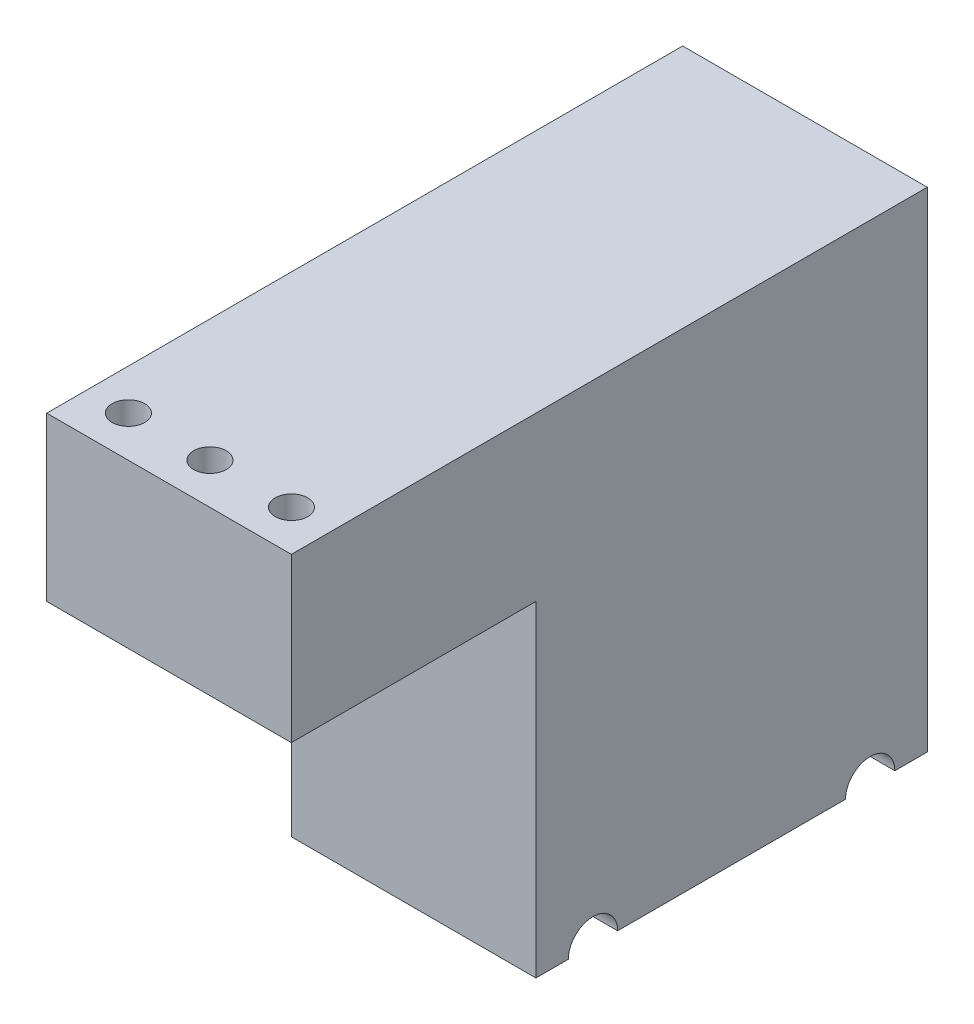
ISO-10303-21;
HEADER;
FILE_DESCRIPTION(('STEP AP214'),'2;1');
FILE_NAME('part.step','',(''),(''),'','','');
FILE_SCHEMA(('AUTOMOTIVE_DESIGN { 1 0 10303 214 1 1 1 1 }'));
ENDSEC;
DATA;
#1=APPLICATION_CONTEXT('core data for automotive mechanical design processes');
#2=APPLICATION_PROTOCOL_DEFINITION('international standard','automotive_design',2000,#1);
#3=PRODUCT_CONTEXT('',#1,'mechanical');
#4=PRODUCT('Part','Part','',(#3));
#5=PRODUCT_RELATED_PRODUCT_CATEGORY('part','',(#4));
#6=PRODUCT_DEFINITION_FORMATION('','',#4);
#7=PRODUCT_DEFINITION_CONTEXT('part definition',#1,'design');
#8=PRODUCT_DEFINITION('design','',#6,#7);
#9=PRODUCT_DEFINITION_SHAPE('','',#8);
#10=(LENGTH_UNIT() NAMED_UNIT(*) SI_UNIT(.MILLI.,.METRE.));
#11=(NAMED_UNIT(*) PLANE_ANGLE_UNIT() SI_UNIT($,.RADIAN.));
#12=(NAMED_UNIT(*) SI_UNIT($,.STERADIAN.) SOLID_ANGLE_UNIT());
#13=UNCERTAINTY_MEASURE_WITH_UNIT(LENGTH_MEASURE(1.E-05),#10,'distance_accuracy_value','');
#14=(GEOMETRIC_REPRESENTATION_CONTEXT(3) GLOBAL_UNCERTAINTY_ASSIGNED_CONTEXT((#13)) GLOBAL_UNIT_ASSIGNED_CONTEXT((#10,
#11,#12)) REPRESENTATION_CONTEXT('',''));
#15=CARTESIAN_POINT('',(0.,0.,0.));
#16=DIRECTION('',(0.,0.,1.));
#17=DIRECTION('',(1.,0.,0.));
#18=AXIS2_PLACEMENT_3D('',#15,#16,#17);
#19=CARTESIAN_POINT('',(0.,0.,48.));
#20=DIRECTION('',(0.,0.,-1.));
#21=DIRECTION('',(-1.,0.,0.));
#22=AXIS2_PLACEMENT_3D('',#19,#20,#21);
#23=PLANE('',#22);
#24=DIRECTION('',(0.,-1.,0.));
#25=VECTOR('',#24,1.);
#26=CARTESIAN_POINT('',(0.,0.,48.));
#27=LINE('',#26,#25);
#28=CARTESIAN_POINT('',(0.,75.,48.));
#29=VERTEX_POINT('',#28);
#30=CARTESIAN_POINT('',(0.,35.,48.));
#31=VERTEX_POINT('',#30);
#32=EDGE_CURVE('E122',#29,#31,#27,.T.);
#33=ORIENTED_EDGE('',*,*,#32,.T.);
#34=DIRECTION('',(-1.,0.,0.));
#35=VECTOR('',#34,1.);
#36=CARTESIAN_POINT('',(30.,35.,48.));
#37=LINE('',#36,#35);
#38=CARTESIAN_POINT('',(30.,35.,48.));
#39=VERTEX_POINT('',#38);
#40=EDGE_CURVE('E109',#39,#31,#37,.T.);
#41=ORIENTED_EDGE('',*,*,#40,.F.);
#42=DIRECTION('',(0.,1.,0.));
#43=VECTOR('',#42,1.);
#44=CARTESIAN_POINT('',(30.,0.,48.));
#45=LINE('',#44,#43);
#46=CARTESIAN_POINT('',(30.,75.,48.));
#47=VERTEX_POINT('',#46);
#48=EDGE_CURVE('E119',#39,#47,#45,.T.);
#49=ORIENTED_EDGE('',*,*,#48,.T.);
#50=DIRECTION('',(1.,0.,0.));
#51=VECTOR('',#50,1.);
#52=CARTESIAN_POINT('',(0.,75.,48.));
#53=LINE('',#52,#51);
#54=EDGE_CURVE('E248',#29,#47,#53,.T.);
#55=ORIENTED_EDGE('',*,*,#54,.F.);
#56=EDGE_LOOP('',(#33,#41,#49,#55));
#57=FACE_BOUND('',#56,.T.);
#58=ADVANCED_FACE('F32',(#57),#23,.F.);
#59=CARTESIAN_POINT('',(0.,0.,48.));
#60=DIRECTION('',(1.,0.,0.));
#61=DIRECTION('',(0.,0.,-1.));
#62=AXIS2_PLACEMENT_3D('',#59,#60,#61);
#63=PLANE('',#62);
#64=DIRECTION('',(0.,-1.,0.));
#65=VECTOR('',#64,1.);
#66=CARTESIAN_POINT('',(0.,0.,0.));
#67=LINE('',#66,#65);
#68=CARTESIAN_POINT('',(0.,95.,0.));
#69=VERTEX_POINT('',#68);
#70=CARTESIAN_POINT('',(0.,35.,0.));
#71=VERTEX_POINT('',#70);
#72=EDGE_CURVE('E138',#69,#71,#67,.T.);
#73=ORIENTED_EDGE('',*,*,#72,.T.);
#74=DIRECTION('',(0.,0.,-1.));
#75=VECTOR('',#74,1.);
#76=CARTESIAN_POINT('',(0.,35.,0.));
#77=LINE('',#76,#75);
#78=CARTESIAN_POINT('',(0.,35.,3.975));
#79=VERTEX_POINT('',#78);
#80=EDGE_CURVE('E157',#79,#71,#77,.T.);
#81=ORIENTED_EDGE('',*,*,#80,.F.);
#82=CARTESIAN_POINT('',(0.,35.,7.));
#83=DIRECTION('',(-1.,0.,0.));
#84=DIRECTION('',(0.,0.,1.));
#85=AXIS2_PLACEMENT_3D('',#82,#83,#84);
#86=CIRCLE('',#85,3.025);
#87=CARTESIAN_POINT('',(0.,35.,10.025));
#88=VERTEX_POINT('',#87);
#89=EDGE_CURVE('E133',#88,#79,#86,.T.);
#90=ORIENTED_EDGE('',*,*,#89,.F.);
#91=CARTESIAN_POINT('',(0.,35.,37.975));
#92=VERTEX_POINT('',#91);
#93=EDGE_CURVE('E156',#92,#88,#77,.T.);
#94=ORIENTED_EDGE('',*,*,#93,.F.);
#95=CARTESIAN_POINT('',(0.,35.,41.));
#96=DIRECTION('',(-1.,0.,0.));
#97=DIRECTION('',(0.,0.,1.));
#98=AXIS2_PLACEMENT_3D('',#95,#96,#97);
#99=CIRCLE('',#98,3.025);
#100=CARTESIAN_POINT('',(0.,35.,44.025));
#101=VERTEX_POINT('',#100);
#102=EDGE_CURVE('E130',#101,#92,#99,.T.);
#103=ORIENTED_EDGE('',*,*,#102,.F.);
#104=EDGE_CURVE('E47',#31,#101,#77,.T.);
#105=ORIENTED_EDGE('',*,*,#104,.F.);
#106=ORIENTED_EDGE('',*,*,#32,.F.);
#107=DIRECTION('',(0.,0.,-1.));
#108=VECTOR('',#107,1.);
#109=CARTESIAN_POINT('',(0.,75.,78.));
#110=LINE('',#109,#108);
#111=CARTESIAN_POINT('',(0.,75.,78.));
#112=VERTEX_POINT('',#111);
#113=EDGE_CURVE('E273',#112,#29,#110,.T.);
#114=ORIENTED_EDGE('',*,*,#113,.F.);
#115=DIRECTION('',(0.,-1.,0.));
#116=VECTOR('',#115,1.);
#117=CARTESIAN_POINT('',(0.,95.,78.));
#118=LINE('',#117,#116);
#119=CARTESIAN_POINT('',(0.,95.,78.));
#120=VERTEX_POINT('',#119);
#121=EDGE_CURVE('E260',#120,#112,#118,.T.);
#122=ORIENTED_EDGE('',*,*,#121,.F.);
#123=DIRECTION('',(0.,0.,-1.));
#124=VECTOR('',#123,1.);
#125=CARTESIAN_POINT('',(0.,95.,48.));
#126=LINE('',#125,#124);
#127=EDGE_CURVE('E278',#120,#69,#126,.T.);
#128=ORIENTED_EDGE('',*,*,#127,.T.);
#129=EDGE_LOOP('',(#73,#81,#90,#94,#103,#105,#106,#114,#122,#128));
#130=FACE_BOUND('',#129,.T.);
#131=ADVANCED_FACE('F34',(#130),#63,.F.);
#132=CARTESIAN_POINT('',(30.,0.,48.));
#133=DIRECTION('',(-1.,0.,0.));
#134=DIRECTION('',(0.,0.,1.));
#135=AXIS2_PLACEMENT_3D('',#132,#133,#134);
#136=PLANE('',#135);
#137=ORIENTED_EDGE('',*,*,#48,.F.);
#138=DIRECTION('',(0.,0.,-1.));
#139=VECTOR('',#138,1.);
#140=CARTESIAN_POINT('',(30.,35.,0.));
#141=LINE('',#140,#139);
#142=CARTESIAN_POINT('',(30.,35.,44.025));
#143=VERTEX_POINT('',#142);
#144=EDGE_CURVE('E106',#39,#143,#141,.T.);
#145=ORIENTED_EDGE('',*,*,#144,.T.);
#146=CARTESIAN_POINT('',(30.,35.,41.));
#147=DIRECTION('',(-1.,0.,0.));
#148=DIRECTION('',(0.,0.,1.));
#149=AXIS2_PLACEMENT_3D('',#146,#147,#148);
#150=CIRCLE('',#149,3.025);
#151=CARTESIAN_POINT('',(30.,35.,37.975));
#152=VERTEX_POINT('',#151);
#153=EDGE_CURVE('E277',#143,#152,#150,.T.);
#154=ORIENTED_EDGE('',*,*,#153,.T.);
#155=CARTESIAN_POINT('',(30.,35.,10.025));
#156=VERTEX_POINT('',#155);
#157=EDGE_CURVE('E115',#152,#156,#141,.T.);
#158=ORIENTED_EDGE('',*,*,#157,.T.);
#159=CARTESIAN_POINT('',(30.,35.,7.));
#160=DIRECTION('',(-1.,0.,0.));
#161=DIRECTION('',(0.,0.,1.));
#162=AXIS2_PLACEMENT_3D('',#159,#160,#161);
#163=CIRCLE('',#162,3.025);
#164=CARTESIAN_POINT('',(30.,35.,3.975));
#165=VERTEX_POINT('',#164);
#166=EDGE_CURVE('E148',#156,#165,#163,.T.);
#167=ORIENTED_EDGE('',*,*,#166,.T.);
#168=CARTESIAN_POINT('',(30.,35.,0.));
#169=VERTEX_POINT('',#168);
#170=EDGE_CURVE('E55',#165,#169,#141,.T.);
#171=ORIENTED_EDGE('',*,*,#170,.T.);
#172=DIRECTION('',(0.,1.,0.));
#173=VECTOR('',#172,1.);
#174=CARTESIAN_POINT('',(30.,0.,0.));
#175=LINE('',#174,#173);
#176=CARTESIAN_POINT('',(30.,95.,0.));
#177=VERTEX_POINT('',#176);
#178=EDGE_CURVE('E280',#169,#177,#175,.T.);
#179=ORIENTED_EDGE('',*,*,#178,.T.);
#180=DIRECTION('',(0.,0.,-1.));
#181=VECTOR('',#180,1.);
#182=CARTESIAN_POINT('',(30.,95.,48.));
#183=LINE('',#182,#181);
#184=CARTESIAN_POINT('',(30.,95.,78.));
#185=VERTEX_POINT('',#184);
#186=EDGE_CURVE('E135',#185,#177,#183,.T.);
#187=ORIENTED_EDGE('',*,*,#186,.F.);
#188=DIRECTION('',(0.,1.,0.));
#189=VECTOR('',#188,1.);
#190=CARTESIAN_POINT('',(30.,95.,78.));
#191=LINE('',#190,#189);
#192=CARTESIAN_POINT('',(30.,75.,78.));
#193=VERTEX_POINT('',#192);
#194=EDGE_CURVE('E265',#193,#185,#191,.T.);
#195=ORIENTED_EDGE('',*,*,#194,.F.);
#196=DIRECTION('',(0.,0.,-1.));
#197=VECTOR('',#196,1.);
#198=CARTESIAN_POINT('',(30.,75.,78.));
#199=LINE('',#198,#197);
#200=EDGE_CURVE('E129',#193,#47,#199,.T.);
#201=ORIENTED_EDGE('',*,*,#200,.T.);
#202=EDGE_LOOP('',(#137,#145,#154,#158,#167,#171,#179,#187,#195,#201));
#203=FACE_BOUND('',#202,.T.);
#204=ADVANCED_FACE('F126',(#203),#136,.F.);
#205=CARTESIAN_POINT('',(0.,95.,48.));
#206=DIRECTION('',(0.,-1.,0.));
#207=DIRECTION('',(0.,0.,-1.));
#208=AXIS2_PLACEMENT_3D('',#205,#206,#207);
#209=PLANE('',#208);
#210=CARTESIAN_POINT('',(5.,95.,72.9836515484408));
#211=DIRECTION('',(0.,1.,0.));
#212=DIRECTION('',(0.,0.,1.));
#213=AXIS2_PLACEMENT_3D('',#210,#211,#212);
#214=CIRCLE('',#213,2.);
#215=CARTESIAN_POINT('',(5.,95.,74.9836515484408));
#216=VERTEX_POINT('',#215);
#217=EDGE_CURVE('E249',#216,#216,#214,.T.);
#218=ORIENTED_EDGE('',*,*,#217,.F.);
#219=EDGE_LOOP('',(#218));
#220=FACE_BOUND('',#219,.T.);
#221=CARTESIAN_POINT('',(15.,95.,72.9836515484408));
#222=DIRECTION('',(0.,1.,0.));
#223=DIRECTION('',(0.,0.,1.));
#224=AXIS2_PLACEMENT_3D('',#221,#222,#223);
#225=CIRCLE('',#224,2.00000000000001);
#226=CARTESIAN_POINT('',(15.,95.,74.9836515484408));
#227=VERTEX_POINT('',#226);
#228=EDGE_CURVE('E255',#227,#227,#225,.T.);
#229=ORIENTED_EDGE('',*,*,#228,.F.);
#230=EDGE_LOOP('',(#229));
#231=FACE_BOUND('',#230,.T.);
#232=CARTESIAN_POINT('',(25.,95.,72.9836515484408));
#233=DIRECTION('',(0.,1.,0.));
#234=DIRECTION('',(0.,0.,1.));
#235=AXIS2_PLACEMENT_3D('',#232,#233,#234);
#236=CIRCLE('',#235,2.00000000000001);
#237=CARTESIAN_POINT('',(25.,95.,74.9836515484408));
#238=VERTEX_POINT('',#237);
#239=EDGE_CURVE('E238',#238,#238,#236,.T.);
#240=ORIENTED_EDGE('',*,*,#239,.F.);
#241=EDGE_LOOP('',(#240));
#242=FACE_BOUND('',#241,.T.);
#243=DIRECTION('',(-1.,0.,0.));
#244=VECTOR('',#243,1.);
#245=CARTESIAN_POINT('',(0.,95.,0.));
#246=LINE('',#245,#244);
#247=EDGE_CURVE('E283',#177,#69,#246,.T.);
#248=ORIENTED_EDGE('',*,*,#247,.T.);
#249=ORIENTED_EDGE('',*,*,#127,.F.);
#250=DIRECTION('',(-1.,0.,0.));
#251=VECTOR('',#250,1.);
#252=CARTESIAN_POINT('',(0.,95.,78.));
#253=LINE('',#252,#251);
#254=EDGE_CURVE('E268',#185,#120,#253,.T.);
#255=ORIENTED_EDGE('',*,*,#254,.F.);
#256=ORIENTED_EDGE('',*,*,#186,.T.);
#257=EDGE_LOOP('',(#248,#249,#255,#256));
#258=FACE_BOUND('',#257,.T.);
#259=ADVANCED_FACE('F289',(#220,#231,#242,#258),#209,.F.);
#260=CARTESIAN_POINT('',(0.,0.,0.));
#261=DIRECTION('',(0.,0.,-1.));
#262=DIRECTION('',(-1.,0.,0.));
#263=AXIS2_PLACEMENT_3D('',#260,#261,#262);
#264=PLANE('',#263);
#265=DIRECTION('',(-1.,0.,0.));
#266=VECTOR('',#265,1.);
#267=CARTESIAN_POINT('',(30.,35.,0.));
#268=LINE('',#267,#266);
#269=EDGE_CURVE('E123',#169,#71,#268,.T.);
#270=ORIENTED_EDGE('',*,*,#269,.T.);
#271=ORIENTED_EDGE('',*,*,#72,.F.);
#272=ORIENTED_EDGE('',*,*,#247,.F.);
#273=ORIENTED_EDGE('',*,*,#178,.F.);
#274=EDGE_LOOP('',(#270,#271,#272,#273));
#275=FACE_BOUND('',#274,.T.);
#276=ADVANCED_FACE('F290',(#275),#264,.T.);
#277=CARTESIAN_POINT('',(46.,35.,41.));
#278=DIRECTION('',(-1.,0.,0.));
#279=DIRECTION('',(0.,0.,1.));
#280=AXIS2_PLACEMENT_3D('',#277,#278,#279);
#281=CYLINDRICAL_SURFACE('',#280,3.025);
#282=ORIENTED_EDGE('',*,*,#102,.T.);
#283=DIRECTION('',(-1.,0.,0.));
#284=VECTOR('',#283,1.);
#285=CARTESIAN_POINT('',(46.,35.,37.975));
#286=LINE('',#285,#284);
#287=EDGE_CURVE('E236',#92,#152,#286,.F.);
#288=ORIENTED_EDGE('',*,*,#287,.T.);
#289=ORIENTED_EDGE('',*,*,#153,.F.);
#290=DIRECTION('',(-1.,0.,0.));
#291=VECTOR('',#290,1.);
#292=CARTESIAN_POINT('',(46.,35.,44.025));
#293=LINE('',#292,#291);
#294=EDGE_CURVE('E110',#143,#101,#293,.T.);
#295=ORIENTED_EDGE('',*,*,#294,.T.);
#296=EDGE_LOOP('',(#282,#288,#289,#295));
#297=FACE_BOUND('',#296,.T.);
#298=ADVANCED_FACE('F308',(#297),#281,.F.);
#299=CARTESIAN_POINT('',(46.,35.,7.));
#300=DIRECTION('',(-1.,0.,0.));
#301=DIRECTION('',(0.,0.,1.));
#302=AXIS2_PLACEMENT_3D('',#299,#300,#301);
#303=CYLINDRICAL_SURFACE('',#302,3.025);
#304=ORIENTED_EDGE('',*,*,#89,.T.);
#305=DIRECTION('',(-1.,0.,0.));
#306=VECTOR('',#305,1.);
#307=CARTESIAN_POINT('',(46.,35.,3.975));
#308=LINE('',#307,#306);
#309=EDGE_CURVE('E11',#79,#165,#308,.F.);
#310=ORIENTED_EDGE('',*,*,#309,.T.);
#311=ORIENTED_EDGE('',*,*,#166,.F.);
#312=DIRECTION('',(-1.,0.,0.));
#313=VECTOR('',#312,1.);
#314=CARTESIAN_POINT('',(46.,35.,10.025));
#315=LINE('',#314,#313);
#316=EDGE_CURVE('E40',#156,#88,#315,.T.);
#317=ORIENTED_EDGE('',*,*,#316,.T.);
#318=EDGE_LOOP('',(#304,#310,#311,#317));
#319=FACE_BOUND('',#318,.T.);
#320=ADVANCED_FACE('F146',(#319),#303,.F.);
#321=CARTESIAN_POINT('',(0.,75.,78.));
#322=DIRECTION('',(0.,1.,0.));
#323=DIRECTION('',(0.,0.,1.));
#324=AXIS2_PLACEMENT_3D('',#321,#322,#323);
#325=PLANE('',#324);
#326=ORIENTED_EDGE('',*,*,#54,.T.);
#327=ORIENTED_EDGE('',*,*,#200,.F.);
#328=DIRECTION('',(1.,0.,0.));
#329=VECTOR('',#328,1.);
#330=CARTESIAN_POINT('',(0.,75.,78.));
#331=LINE('',#330,#329);
#332=EDGE_CURVE('E263',#112,#193,#331,.T.);
#333=ORIENTED_EDGE('',*,*,#332,.F.);
#334=ORIENTED_EDGE('',*,*,#113,.T.);
#335=EDGE_LOOP('',(#326,#327,#333,#334));
#336=FACE_BOUND('',#335,.T.);
#337=ADVANCED_FACE('F312',(#336),#325,.F.);
#338=CARTESIAN_POINT('',(0.,0.,78.));
#339=DIRECTION('',(0.,0.,1.));
#340=DIRECTION('',(1.,0.,0.));
#341=AXIS2_PLACEMENT_3D('',#338,#339,#340);
#342=PLANE('',#341);
#343=ORIENTED_EDGE('',*,*,#121,.T.);
#344=ORIENTED_EDGE('',*,*,#332,.T.);
#345=ORIENTED_EDGE('',*,*,#194,.T.);
#346=ORIENTED_EDGE('',*,*,#254,.T.);
#347=EDGE_LOOP('',(#343,#344,#345,#346));
#348=FACE_BOUND('',#347,.T.);
#349=ADVANCED_FACE('F328',(#348),#342,.T.);
#350=CARTESIAN_POINT('',(25.,90.,72.9836515484408));
#351=DIRECTION('',(0.,1.,0.));
#352=DIRECTION('',(0.,0.,1.));
#353=AXIS2_PLACEMENT_3D('',#350,#351,#352);
#354=CYLINDRICAL_SURFACE('',#353,2.00000000000001);
#355=CARTESIAN_POINT('',(25.,90.,72.9836515484408));
#356=DIRECTION('',(0.,1.,0.));
#357=DIRECTION('',(0.,0.,1.));
#358=AXIS2_PLACEMENT_3D('',#355,#356,#357);
#359=CIRCLE('',#358,2.00000000000001);
#360=CARTESIAN_POINT('',(25.,90.,74.9836515484408));
#361=VERTEX_POINT('',#360);
#362=EDGE_CURVE('E241',#361,#361,#359,.T.);
#363=ORIENTED_EDGE('',*,*,#362,.F.);
#364=EDGE_LOOP('',(#363));
#365=FACE_BOUND('',#364,.T.);
#366=ORIENTED_EDGE('',*,*,#239,.T.);
#367=EDGE_LOOP('',(#366));
#368=FACE_BOUND('',#367,.T.);
#369=ADVANCED_FACE('F332',(#365,#368),#354,.F.);
#370=CARTESIAN_POINT('',(25.,90.,72.9836515484408));
#371=DIRECTION('',(0.,1.,0.));
#372=DIRECTION('',(0.,0.,1.));
#373=AXIS2_PLACEMENT_3D('',#370,#371,#372);
#374=PLANE('',#373);
#375=ORIENTED_EDGE('',*,*,#362,.T.);
#376=EDGE_LOOP('',(#375));
#377=FACE_BOUND('',#376,.T.);
#378=ADVANCED_FACE('F336',(#377),#374,.T.);
#379=CARTESIAN_POINT('',(15.,90.,72.9836515484408));
#380=DIRECTION('',(0.,1.,0.));
#381=DIRECTION('',(0.,0.,1.));
#382=AXIS2_PLACEMENT_3D('',#379,#380,#381);
#383=CYLINDRICAL_SURFACE('',#382,2.00000000000001);
#384=CARTESIAN_POINT('',(15.,90.,72.9836515484408));
#385=DIRECTION('',(0.,1.,0.));
#386=DIRECTION('',(0.,0.,1.));
#387=AXIS2_PLACEMENT_3D('',#384,#385,#386);
#388=CIRCLE('',#387,2.00000000000001);
#389=CARTESIAN_POINT('',(15.,90.,74.9836515484408));
#390=VERTEX_POINT('',#389);
#391=EDGE_CURVE('E252',#390,#390,#388,.T.);
#392=ORIENTED_EDGE('',*,*,#391,.F.);
#393=EDGE_LOOP('',(#392));
#394=FACE_BOUND('',#393,.T.);
#395=ORIENTED_EDGE('',*,*,#228,.T.);
#396=EDGE_LOOP('',(#395));
#397=FACE_BOUND('',#396,.T.);
#398=ADVANCED_FACE('F340',(#394,#397),#383,.F.);
#399=CARTESIAN_POINT('',(15.,90.,72.9836515484408));
#400=DIRECTION('',(0.,1.,0.));
#401=DIRECTION('',(0.,0.,1.));
#402=AXIS2_PLACEMENT_3D('',#399,#400,#401);
#403=PLANE('',#402);
#404=ORIENTED_EDGE('',*,*,#391,.T.);
#405=EDGE_LOOP('',(#404));
#406=FACE_BOUND('',#405,.T.);
#407=ADVANCED_FACE('F344',(#406),#403,.T.);
#408=CARTESIAN_POINT('',(5.,90.,72.9836515484408));
#409=DIRECTION('',(0.,1.,0.));
#410=DIRECTION('',(0.,0.,1.));
#411=AXIS2_PLACEMENT_3D('',#408,#409,#410);
#412=CYLINDRICAL_SURFACE('',#411,2.);
#413=CARTESIAN_POINT('',(5.,90.,72.9836515484408));
#414=DIRECTION('',(0.,1.,0.));
#415=DIRECTION('',(0.,0.,1.));
#416=AXIS2_PLACEMENT_3D('',#413,#414,#415);
#417=CIRCLE('',#416,2.);
#418=CARTESIAN_POINT('',(5.,90.,74.9836515484408));
#419=VERTEX_POINT('',#418);
#420=EDGE_CURVE('E245',#419,#419,#417,.T.);
#421=ORIENTED_EDGE('',*,*,#420,.F.);
#422=EDGE_LOOP('',(#421));
#423=FACE_BOUND('',#422,.T.);
#424=ORIENTED_EDGE('',*,*,#217,.T.);
#425=EDGE_LOOP('',(#424));
#426=FACE_BOUND('',#425,.T.);
#427=ADVANCED_FACE('F348',(#423,#426),#412,.F.);
#428=CARTESIAN_POINT('',(5.,90.,72.9836515484408));
#429=DIRECTION('',(0.,1.,0.));
#430=DIRECTION('',(0.,0.,1.));
#431=AXIS2_PLACEMENT_3D('',#428,#429,#430);
#432=PLANE('',#431);
#433=ORIENTED_EDGE('',*,*,#420,.T.);
#434=EDGE_LOOP('',(#433));
#435=FACE_BOUND('',#434,.T.);
#436=ADVANCED_FACE('F227',(#435),#432,.T.);
#437=CARTESIAN_POINT('',(30.,35.,0.));
#438=DIRECTION('',(0.,1.,0.));
#439=DIRECTION('',(0.,0.,1.));
#440=AXIS2_PLACEMENT_3D('',#437,#438,#439);
#441=PLANE('',#440);
#442=CARTESIAN_POINT('',(6.,35.,16.025));
#443=DIRECTION('',(0.,-1.,0.));
#444=DIRECTION('',(0.,0.,-1.));
#445=AXIS2_PLACEMENT_3D('',#442,#443,#444);
#446=CIRCLE('',#445,2.);
#447=CARTESIAN_POINT('',(6.,35.,14.025));
#448=VERTEX_POINT('',#447);
#449=EDGE_CURVE('E184',#448,#448,#446,.T.);
#450=ORIENTED_EDGE('',*,*,#449,.F.);
#451=EDGE_LOOP('',(#450));
#452=FACE_BOUND('',#451,.T.);
#453=CARTESIAN_POINT('',(24.,35.,31.975));
#454=DIRECTION('',(0.,-1.,0.));
#455=DIRECTION('',(0.,0.,-1.));
#456=AXIS2_PLACEMENT_3D('',#453,#454,#455);
#457=CIRCLE('',#456,2.);
#458=CARTESIAN_POINT('',(24.,35.,29.975));
#459=VERTEX_POINT('',#458);
#460=EDGE_CURVE('E191',#459,#459,#457,.T.);
#461=ORIENTED_EDGE('',*,*,#460,.F.);
#462=EDGE_LOOP('',(#461));
#463=FACE_BOUND('',#462,.T.);
#464=CARTESIAN_POINT('',(18.,35.,31.975));
#465=DIRECTION('',(0.,-1.,0.));
#466=DIRECTION('',(0.,0.,-1.));
#467=AXIS2_PLACEMENT_3D('',#464,#465,#466);
#468=CIRCLE('',#467,2.);
#469=CARTESIAN_POINT('',(18.,35.,29.975));
#470=VERTEX_POINT('',#469);
#471=EDGE_CURVE('E172',#470,#470,#468,.T.);
#472=ORIENTED_EDGE('',*,*,#471,.F.);
#473=EDGE_LOOP('',(#472));
#474=FACE_BOUND('',#473,.T.);
#475=CARTESIAN_POINT('',(12.,35.,31.975));
#476=DIRECTION('',(0.,-1.,0.));
#477=DIRECTION('',(0.,0.,-1.));
#478=AXIS2_PLACEMENT_3D('',#475,#476,#477);
#479=CIRCLE('',#478,2.);
#480=CARTESIAN_POINT('',(12.,35.,29.975));
#481=VERTEX_POINT('',#480);
#482=EDGE_CURVE('E179',#481,#481,#479,.T.);
#483=ORIENTED_EDGE('',*,*,#482,.F.);
#484=EDGE_LOOP('',(#483));
#485=FACE_BOUND('',#484,.T.);
#486=CARTESIAN_POINT('',(12.,35.,16.025));
#487=DIRECTION('',(0.,-1.,0.));
#488=DIRECTION('',(0.,0.,-1.));
#489=AXIS2_PLACEMENT_3D('',#486,#487,#488);
#490=CIRCLE('',#489,2.);
#491=CARTESIAN_POINT('',(12.,35.,14.025));
#492=VERTEX_POINT('',#491);
#493=EDGE_CURVE('E208',#492,#492,#490,.T.);
#494=ORIENTED_EDGE('',*,*,#493,.F.);
#495=EDGE_LOOP('',(#494));
#496=FACE_BOUND('',#495,.T.);
#497=CARTESIAN_POINT('',(18.,35.,16.025));
#498=DIRECTION('',(0.,-1.,0.));
#499=DIRECTION('',(0.,0.,-1.));
#500=AXIS2_PLACEMENT_3D('',#497,#498,#499);
#501=CIRCLE('',#500,2.);
#502=CARTESIAN_POINT('',(18.,35.,14.025));
#503=VERTEX_POINT('',#502);
#504=EDGE_CURVE('E202',#503,#503,#501,.T.);
#505=ORIENTED_EDGE('',*,*,#504,.F.);
#506=EDGE_LOOP('',(#505));
#507=FACE_BOUND('',#506,.T.);
#508=CARTESIAN_POINT('',(24.,35.,16.025));
#509=DIRECTION('',(0.,-1.,0.));
#510=DIRECTION('',(0.,0.,-1.));
#511=AXIS2_PLACEMENT_3D('',#508,#509,#510);
#512=CIRCLE('',#511,2.);
#513=CARTESIAN_POINT('',(24.,35.,14.025));
#514=VERTEX_POINT('',#513);
#515=EDGE_CURVE('E196',#514,#514,#512,.T.);
#516=ORIENTED_EDGE('',*,*,#515,.F.);
#517=EDGE_LOOP('',(#516));
#518=FACE_BOUND('',#517,.T.);
#519=CARTESIAN_POINT('',(6.,35.,31.975));
#520=DIRECTION('',(0.,-1.,0.));
#521=DIRECTION('',(0.,0.,-1.));
#522=AXIS2_PLACEMENT_3D('',#519,#520,#521);
#523=CIRCLE('',#522,2.00000000000008);
#524=CARTESIAN_POINT('',(6.,35.,29.9749999999999));
#525=VERTEX_POINT('',#524);
#526=EDGE_CURVE('E164',#525,#525,#523,.T.);
#527=ORIENTED_EDGE('',*,*,#526,.F.);
#528=EDGE_LOOP('',(#527));
#529=FACE_BOUND('',#528,.T.);
#530=ORIENTED_EDGE('',*,*,#93,.T.);
#531=ORIENTED_EDGE('',*,*,#316,.F.);
#532=ORIENTED_EDGE('',*,*,#157,.F.);
#533=ORIENTED_EDGE('',*,*,#287,.F.);
#534=EDGE_LOOP('',(#530,#531,#532,#533));
#535=FACE_BOUND('',#534,.T.);
#536=ADVANCED_FACE('F223',(#452,#463,#474,#485,#496,#507,#518,#529,#535),#441,.F.);
#537=ORIENTED_EDGE('',*,*,#80,.T.);
#538=ORIENTED_EDGE('',*,*,#269,.F.);
#539=ORIENTED_EDGE('',*,*,#170,.F.);
#540=ORIENTED_EDGE('',*,*,#309,.F.);
#541=EDGE_LOOP('',(#537,#538,#539,#540));
#542=FACE_BOUND('',#541,.T.);
#543=ADVANCED_FACE('F226',(#542),#441,.F.);
#544=ORIENTED_EDGE('',*,*,#144,.F.);
#545=ORIENTED_EDGE('',*,*,#40,.T.);
#546=ORIENTED_EDGE('',*,*,#104,.T.);
#547=ORIENTED_EDGE('',*,*,#294,.F.);
#548=EDGE_LOOP('',(#544,#545,#546,#547));
#549=FACE_BOUND('',#548,.T.);
#550=ADVANCED_FACE('F108',(#549),#441,.F.);
#551=CARTESIAN_POINT('',(6.,40.,31.975));
#552=DIRECTION('',(0.,-1.,0.));
#553=DIRECTION('',(0.,0.,-1.));
#554=AXIS2_PLACEMENT_3D('',#551,#552,#553);
#555=CYLINDRICAL_SURFACE('',#554,2.00000000000008);
#556=CARTESIAN_POINT('',(6.,40.,31.975));
#557=DIRECTION('',(0.,-1.,0.));
#558=DIRECTION('',(0.,0.,-1.));
#559=AXIS2_PLACEMENT_3D('',#556,#557,#558);
#560=CIRCLE('',#559,2.00000000000008);
#561=CARTESIAN_POINT('',(6.,40.,29.9749999999999));
#562=VERTEX_POINT('',#561);
#563=EDGE_CURVE('E161',#562,#562,#560,.T.);
#564=ORIENTED_EDGE('',*,*,#563,.F.);
#565=EDGE_LOOP('',(#564));
#566=FACE_BOUND('',#565,.T.);
#567=ORIENTED_EDGE('',*,*,#526,.T.);
#568=EDGE_LOOP('',(#567));
#569=FACE_BOUND('',#568,.T.);
#570=ADVANCED_FACE('F296',(#566,#569),#555,.F.);
#571=CARTESIAN_POINT('',(6.,40.,31.975));
#572=DIRECTION('',(0.,-1.,0.));
#573=DIRECTION('',(0.,0.,-1.));
#574=AXIS2_PLACEMENT_3D('',#571,#572,#573);
#575=PLANE('',#574);
#576=ORIENTED_EDGE('',*,*,#563,.T.);
#577=EDGE_LOOP('',(#576));
#578=FACE_BOUND('',#577,.T.);
#579=ADVANCED_FACE('F375',(#578),#575,.T.);
#580=CARTESIAN_POINT('',(24.,40.,16.025));
#581=DIRECTION('',(0.,-1.,0.));
#582=DIRECTION('',(0.,0.,-1.));
#583=AXIS2_PLACEMENT_3D('',#580,#581,#582);
#584=CYLINDRICAL_SURFACE('',#583,2.);
#585=CARTESIAN_POINT('',(24.,40.,16.025));
#586=DIRECTION('',(0.,-1.,0.));
#587=DIRECTION('',(0.,0.,-1.));
#588=AXIS2_PLACEMENT_3D('',#585,#586,#587);
#589=CIRCLE('',#588,2.);
#590=CARTESIAN_POINT('',(24.,40.,14.025));
#591=VERTEX_POINT('',#590);
#592=EDGE_CURVE('E199',#591,#591,#589,.T.);
#593=ORIENTED_EDGE('',*,*,#592,.F.);
#594=EDGE_LOOP('',(#593));
#595=FACE_BOUND('',#594,.T.);
#596=ORIENTED_EDGE('',*,*,#515,.T.);
#597=EDGE_LOOP('',(#596));
#598=FACE_BOUND('',#597,.T.);
#599=ADVANCED_FACE('F384',(#595,#598),#584,.F.);
#600=CARTESIAN_POINT('',(24.,40.,16.025));
#601=DIRECTION('',(0.,-1.,0.));
#602=DIRECTION('',(0.,0.,-1.));
#603=AXIS2_PLACEMENT_3D('',#600,#601,#602);
#604=PLANE('',#603);
#605=ORIENTED_EDGE('',*,*,#592,.T.);
#606=EDGE_LOOP('',(#605));
#607=FACE_BOUND('',#606,.T.);
#608=ADVANCED_FACE('F394',(#607),#604,.T.);
#609=CARTESIAN_POINT('',(18.,40.,16.025));
#610=DIRECTION('',(0.,-1.,0.));
#611=DIRECTION('',(0.,0.,-1.));
#612=AXIS2_PLACEMENT_3D('',#609,#610,#611);
#613=CYLINDRICAL_SURFACE('',#612,2.);
#614=CARTESIAN_POINT('',(18.,40.,16.025));
#615=DIRECTION('',(0.,-1.,0.));
#616=DIRECTION('',(0.,0.,-1.));
#617=AXIS2_PLACEMENT_3D('',#614,#615,#616);
#618=CIRCLE('',#617,2.);
#619=CARTESIAN_POINT('',(18.,40.,14.025));
#620=VERTEX_POINT('',#619);
#621=EDGE_CURVE('E205',#620,#620,#618,.T.);
#622=ORIENTED_EDGE('',*,*,#621,.F.);
#623=EDGE_LOOP('',(#622));
#624=FACE_BOUND('',#623,.T.);
#625=ORIENTED_EDGE('',*,*,#504,.T.);
#626=EDGE_LOOP('',(#625));
#627=FACE_BOUND('',#626,.T.);
#628=ADVANCED_FACE('F404',(#624,#627),#613,.F.);
#629=CARTESIAN_POINT('',(18.,40.,16.025));
#630=DIRECTION('',(0.,-1.,0.));
#631=DIRECTION('',(0.,0.,-1.));
#632=AXIS2_PLACEMENT_3D('',#629,#630,#631);
#633=PLANE('',#632);
#634=ORIENTED_EDGE('',*,*,#621,.T.);
#635=EDGE_LOOP('',(#634));
#636=FACE_BOUND('',#635,.T.);
#637=ADVANCED_FACE('F219',(#636),#633,.T.);
#638=CARTESIAN_POINT('',(12.,40.,16.025));
#639=DIRECTION('',(0.,-1.,0.));
#640=DIRECTION('',(0.,0.,-1.));
#641=AXIS2_PLACEMENT_3D('',#638,#639,#640);
#642=CYLINDRICAL_SURFACE('',#641,2.);
#643=CARTESIAN_POINT('',(12.,40.,16.025));
#644=DIRECTION('',(0.,-1.,0.));
#645=DIRECTION('',(0.,0.,-1.));
#646=AXIS2_PLACEMENT_3D('',#643,#644,#645);
#647=CIRCLE('',#646,2.);
#648=CARTESIAN_POINT('',(12.,40.,14.025));
#649=VERTEX_POINT('',#648);
#650=EDGE_CURVE('E188',#649,#649,#647,.T.);
#651=ORIENTED_EDGE('',*,*,#650,.F.);
#652=EDGE_LOOP('',(#651));
#653=FACE_BOUND('',#652,.T.);
#654=ORIENTED_EDGE('',*,*,#493,.T.);
#655=EDGE_LOOP('',(#654));
#656=FACE_BOUND('',#655,.T.);
#657=ADVANCED_FACE('F216',(#653,#656),#642,.F.);
#658=CARTESIAN_POINT('',(12.,40.,16.025));
#659=DIRECTION('',(0.,-1.,0.));
#660=DIRECTION('',(0.,0.,-1.));
#661=AXIS2_PLACEMENT_3D('',#658,#659,#660);
#662=PLANE('',#661);
#663=ORIENTED_EDGE('',*,*,#650,.T.);
#664=EDGE_LOOP('',(#663));
#665=FACE_BOUND('',#664,.T.);
#666=ADVANCED_FACE('F214',(#665),#662,.T.);
#667=CARTESIAN_POINT('',(12.,40.,31.975));
#668=DIRECTION('',(0.,-1.,0.));
#669=DIRECTION('',(0.,0.,-1.));
#670=AXIS2_PLACEMENT_3D('',#667,#668,#669);
#671=CYLINDRICAL_SURFACE('',#670,2.);
#672=CARTESIAN_POINT('',(12.,40.,31.975));
#673=DIRECTION('',(0.,-1.,0.));
#674=DIRECTION('',(0.,0.,-1.));
#675=AXIS2_PLACEMENT_3D('',#672,#673,#674);
#676=CIRCLE('',#675,2.);
#677=CARTESIAN_POINT('',(12.,40.,29.975));
#678=VERTEX_POINT('',#677);
#679=EDGE_CURVE('E170',#678,#678,#676,.T.);
#680=ORIENTED_EDGE('',*,*,#679,.F.);
#681=EDGE_LOOP('',(#680));
#682=FACE_BOUND('',#681,.T.);
#683=ORIENTED_EDGE('',*,*,#482,.T.);
#684=EDGE_LOOP('',(#683));
#685=FACE_BOUND('',#684,.T.);
#686=ADVANCED_FACE('F438',(#682,#685),#671,.F.);
#687=CARTESIAN_POINT('',(12.,40.,31.975));
#688=DIRECTION('',(0.,-1.,0.));
#689=DIRECTION('',(0.,0.,-1.));
#690=AXIS2_PLACEMENT_3D('',#687,#688,#689);
#691=PLANE('',#690);
#692=ORIENTED_EDGE('',*,*,#679,.T.);
#693=EDGE_LOOP('',(#692));
#694=FACE_BOUND('',#693,.T.);
#695=ADVANCED_FACE('F447',(#694),#691,.T.);
#696=CARTESIAN_POINT('',(18.,40.,31.975));
#697=DIRECTION('',(0.,-1.,0.));
#698=DIRECTION('',(0.,0.,-1.));
#699=AXIS2_PLACEMENT_3D('',#696,#697,#698);
#700=CYLINDRICAL_SURFACE('',#699,2.);
#701=CARTESIAN_POINT('',(18.,40.,31.975));
#702=DIRECTION('',(0.,-1.,0.));
#703=DIRECTION('',(0.,0.,-1.));
#704=AXIS2_PLACEMENT_3D('',#701,#702,#703);
#705=CIRCLE('',#704,2.);
#706=CARTESIAN_POINT('',(18.,40.,29.975));
#707=VERTEX_POINT('',#706);
#708=EDGE_CURVE('E175',#707,#707,#705,.T.);
#709=ORIENTED_EDGE('',*,*,#708,.F.);
#710=EDGE_LOOP('',(#709));
#711=FACE_BOUND('',#710,.T.);
#712=ORIENTED_EDGE('',*,*,#471,.T.);
#713=EDGE_LOOP('',(#712));
#714=FACE_BOUND('',#713,.T.);
#715=ADVANCED_FACE('F457',(#711,#714),#700,.F.);
#716=CARTESIAN_POINT('',(18.,40.,31.975));
#717=DIRECTION('',(0.,-1.,0.));
#718=DIRECTION('',(0.,0.,-1.));
#719=AXIS2_PLACEMENT_3D('',#716,#717,#718);
#720=PLANE('',#719);
#721=ORIENTED_EDGE('',*,*,#708,.T.);
#722=EDGE_LOOP('',(#721));
#723=FACE_BOUND('',#722,.T.);
#724=ADVANCED_FACE('F467',(#723),#720,.T.);
#725=CARTESIAN_POINT('',(24.,40.,31.975));
#726=DIRECTION('',(0.,-1.,0.));
#727=DIRECTION('',(0.,0.,-1.));
#728=AXIS2_PLACEMENT_3D('',#725,#726,#727);
#729=CYLINDRICAL_SURFACE('',#728,2.);
#730=CARTESIAN_POINT('',(24.,40.,31.975));
#731=DIRECTION('',(0.,-1.,0.));
#732=DIRECTION('',(0.,0.,-1.));
#733=AXIS2_PLACEMENT_3D('',#730,#731,#732);
#734=CIRCLE('',#733,2.);
#735=CARTESIAN_POINT('',(24.,40.,29.975));
#736=VERTEX_POINT('',#735);
#737=EDGE_CURVE('E176',#736,#736,#734,.T.);
#738=ORIENTED_EDGE('',*,*,#737,.F.);
#739=EDGE_LOOP('',(#738));
#740=FACE_BOUND('',#739,.T.);
#741=ORIENTED_EDGE('',*,*,#460,.T.);
#742=EDGE_LOOP('',(#741));
#743=FACE_BOUND('',#742,.T.);
#744=ADVANCED_FACE('F477',(#740,#743),#729,.F.);
#745=CARTESIAN_POINT('',(24.,40.,31.975));
#746=DIRECTION('',(0.,-1.,0.));
#747=DIRECTION('',(0.,0.,-1.));
#748=AXIS2_PLACEMENT_3D('',#745,#746,#747);
#749=PLANE('',#748);
#750=ORIENTED_EDGE('',*,*,#737,.T.);
#751=EDGE_LOOP('',(#750));
#752=FACE_BOUND('',#751,.T.);
#753=ADVANCED_FACE('F487',(#752),#749,.T.);
#754=CARTESIAN_POINT('',(6.,40.,16.025));
#755=DIRECTION('',(0.,-1.,0.));
#756=DIRECTION('',(0.,0.,-1.));
#757=AXIS2_PLACEMENT_3D('',#754,#755,#756);
#758=CYLINDRICAL_SURFACE('',#757,2.);
#759=CARTESIAN_POINT('',(6.,40.,16.025));
#760=DIRECTION('',(0.,-1.,0.));
#761=DIRECTION('',(0.,0.,-1.));
#762=AXIS2_PLACEMENT_3D('',#759,#760,#761);
#763=CIRCLE('',#762,2.);
#764=CARTESIAN_POINT('',(6.,40.,14.025));
#765=VERTEX_POINT('',#764);
#766=EDGE_CURVE('E187',#765,#765,#763,.T.);
#767=ORIENTED_EDGE('',*,*,#766,.F.);
#768=EDGE_LOOP('',(#767));
#769=FACE_BOUND('',#768,.T.);
#770=ORIENTED_EDGE('',*,*,#449,.T.);
#771=EDGE_LOOP('',(#770));
#772=FACE_BOUND('',#771,.T.);
#773=ADVANCED_FACE('F497',(#769,#772),#758,.F.);
#774=CARTESIAN_POINT('',(6.,40.,16.025));
#775=DIRECTION('',(0.,-1.,0.));
#776=DIRECTION('',(0.,0.,-1.));
#777=AXIS2_PLACEMENT_3D('',#774,#775,#776);
#778=PLANE('',#777);
#779=ORIENTED_EDGE('',*,*,#766,.T.);
#780=EDGE_LOOP('',(#779));
#781=FACE_BOUND('',#780,.T.);
#782=ADVANCED_FACE('F507',(#781),#778,.T.);
#783=CLOSED_SHELL('',(#58,#131,#204,#259,#276,#298,#320,#337,#349,#369,#378,#398,#407,#427,#436,
#536,#543,#550,#570,#579,#599,#608,#628,#637,#657,#666,#686,#695,#715,#724,#744,#753,#773,#782));
#784=MANIFOLD_SOLID_BREP('B2',#783);
#785=ADVANCED_BREP_SHAPE_REPRESENTATION('',(#18,#784),#14);
#786=SHAPE_DEFINITION_REPRESENTATION(#9,#785);
ENDSEC;
END-ISO-10303-21;
